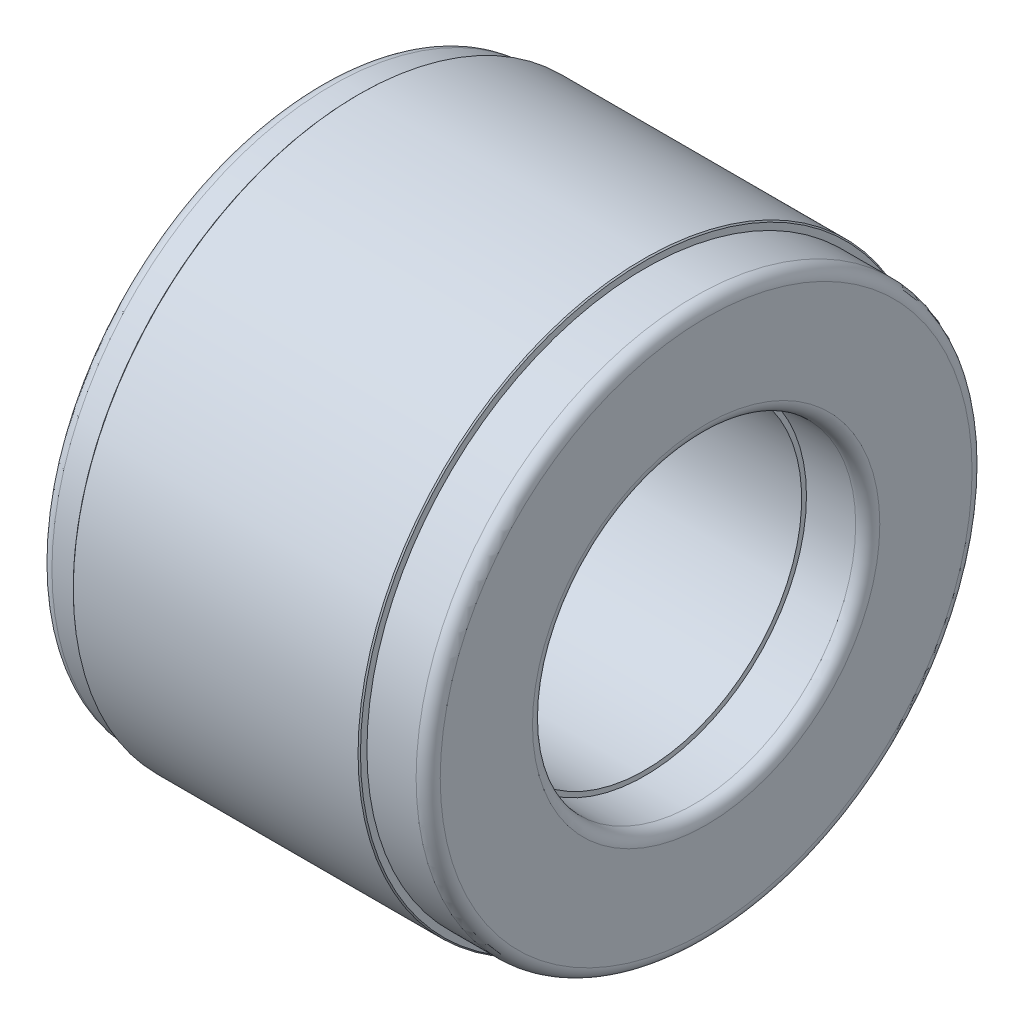
ISO-10303-21;
HEADER;
FILE_DESCRIPTION(('STEP AP214'),'2;1');
FILE_NAME('part.step','',(''),(''),'','','');
FILE_SCHEMA(('AUTOMOTIVE_DESIGN { 1 0 10303 214 1 1 1 1 }'));
ENDSEC;
DATA;
#1=APPLICATION_CONTEXT('core data for automotive mechanical design processes');
#2=APPLICATION_PROTOCOL_DEFINITION('international standard','automotive_design',2000,#1);
#3=PRODUCT_CONTEXT('',#1,'mechanical');
#4=PRODUCT('Part','Part','',(#3));
#5=PRODUCT_RELATED_PRODUCT_CATEGORY('part','',(#4));
#6=PRODUCT_DEFINITION_FORMATION('','',#4);
#7=PRODUCT_DEFINITION_CONTEXT('part definition',#1,'design');
#8=PRODUCT_DEFINITION('design','',#6,#7);
#9=PRODUCT_DEFINITION_SHAPE('','',#8);
#10=(LENGTH_UNIT() NAMED_UNIT(*) SI_UNIT(.MILLI.,.METRE.));
#11=(NAMED_UNIT(*) PLANE_ANGLE_UNIT() SI_UNIT($,.RADIAN.));
#12=(NAMED_UNIT(*) SI_UNIT($,.STERADIAN.) SOLID_ANGLE_UNIT());
#13=UNCERTAINTY_MEASURE_WITH_UNIT(LENGTH_MEASURE(1.E-05),#10,'distance_accuracy_value','');
#14=(GEOMETRIC_REPRESENTATION_CONTEXT(3) GLOBAL_UNCERTAINTY_ASSIGNED_CONTEXT((#13)) GLOBAL_UNIT_ASSIGNED_CONTEXT((#10,
#11,#12)) REPRESENTATION_CONTEXT('',''));
#15=CARTESIAN_POINT('',(0.,0.,0.));
#16=DIRECTION('',(0.,0.,1.));
#17=DIRECTION('',(1.,0.,0.));
#18=AXIS2_PLACEMENT_3D('',#15,#16,#17);
#19=CARTESIAN_POINT('',(0.,0.,0.));
#20=DIRECTION('',(-1.,0.,0.));
#21=DIRECTION('',(0.,0.,1.));
#22=AXIS2_PLACEMENT_3D('',#19,#20,#21);
#23=CYLINDRICAL_SURFACE('',#22,46.355);
#24=CARTESIAN_POINT('',(2.,0.,0.));
#25=DIRECTION('',(1.,0.,0.));
#26=DIRECTION('',(0.,0.,-1.));
#27=AXIS2_PLACEMENT_3D('',#24,#25,#26);
#28=CIRCLE('',#27,46.355);
#29=CARTESIAN_POINT('',(2.,0.,-46.355));
#30=VERTEX_POINT('',#29);
#31=EDGE_CURVE('E66',#30,#30,#28,.T.);
#32=ORIENTED_EDGE('',*,*,#31,.T.);
#33=EDGE_LOOP('',(#32));
#34=FACE_BOUND('',#33,.T.);
#35=CARTESIAN_POINT('',(6.35,0.,0.));
#36=DIRECTION('',(-1.,0.,0.));
#37=DIRECTION('',(0.,0.,1.));
#38=AXIS2_PLACEMENT_3D('',#35,#36,#37);
#39=CIRCLE('',#38,46.355);
#40=CARTESIAN_POINT('',(6.35,0.,46.355));
#41=VERTEX_POINT('',#40);
#42=EDGE_CURVE('E93',#41,#41,#39,.T.);
#43=ORIENTED_EDGE('',*,*,#42,.T.);
#44=EDGE_LOOP('',(#43));
#45=FACE_BOUND('',#44,.T.);
#46=ADVANCED_FACE('F34',(#34,#45),#23,.T.);
#47=CARTESIAN_POINT('',(0.,46.355,0.));
#48=DIRECTION('',(1.,0.,0.));
#49=DIRECTION('',(0.,0.,-1.));
#50=AXIS2_PLACEMENT_3D('',#47,#48,#49);
#51=PLANE('',#50);
#52=CARTESIAN_POINT('',(0.,0.,0.));
#53=DIRECTION('',(1.,0.,0.));
#54=DIRECTION('',(0.,0.,-1.));
#55=AXIS2_PLACEMENT_3D('',#52,#53,#54);
#56=CIRCLE('',#55,29.305);
#57=CARTESIAN_POINT('',(0.,0.,-29.305));
#58=VERTEX_POINT('',#57);
#59=EDGE_CURVE('E69',#58,#58,#56,.T.);
#60=ORIENTED_EDGE('',*,*,#59,.T.);
#61=EDGE_LOOP('',(#60));
#62=FACE_BOUND('',#61,.T.);
#63=CARTESIAN_POINT('',(0.,0.,0.));
#64=DIRECTION('',(1.,0.,0.));
#65=DIRECTION('',(0.,0.,-1.));
#66=AXIS2_PLACEMENT_3D('',#63,#64,#65);
#67=CIRCLE('',#66,44.355);
#68=CARTESIAN_POINT('',(0.,0.,-44.355));
#69=VERTEX_POINT('',#68);
#70=EDGE_CURVE('E72',#69,#69,#67,.F.);
#71=ORIENTED_EDGE('',*,*,#70,.T.);
#72=EDGE_LOOP('',(#71));
#73=FACE_BOUND('',#72,.T.);
#74=ADVANCED_FACE('F114',(#62,#73),#51,.F.);
#75=CARTESIAN_POINT('',(0.,0.,0.));
#76=DIRECTION('',(-1.,0.,0.));
#77=DIRECTION('',(0.,0.,1.));
#78=AXIS2_PLACEMENT_3D('',#75,#76,#77);
#79=CYLINDRICAL_SURFACE('',#78,27.305);
#80=CARTESIAN_POINT('',(2.,0.,0.));
#81=DIRECTION('',(1.,0.,0.));
#82=DIRECTION('',(0.,0.,-1.));
#83=AXIS2_PLACEMENT_3D('',#80,#81,#82);
#84=CIRCLE('',#83,27.305);
#85=CARTESIAN_POINT('',(2.,0.,-27.305));
#86=VERTEX_POINT('',#85);
#87=EDGE_CURVE('E75',#86,#86,#84,.F.);
#88=ORIENTED_EDGE('',*,*,#87,.T.);
#89=EDGE_LOOP('',(#88));
#90=FACE_BOUND('',#89,.T.);
#91=CARTESIAN_POINT('',(6.35,0.,0.));
#92=DIRECTION('',(-1.,0.,0.));
#93=DIRECTION('',(0.,0.,1.));
#94=AXIS2_PLACEMENT_3D('',#91,#92,#93);
#95=CIRCLE('',#94,27.305);
#96=CARTESIAN_POINT('',(6.35,0.,27.305));
#97=VERTEX_POINT('',#96);
#98=EDGE_CURVE('E78',#97,#97,#95,.T.);
#99=ORIENTED_EDGE('',*,*,#98,.F.);
#100=EDGE_LOOP('',(#99));
#101=FACE_BOUND('',#100,.T.);
#102=ADVANCED_FACE('F120',(#90,#101),#79,.F.);
#103=CARTESIAN_POINT('',(6.35,27.305,0.));
#104=DIRECTION('',(1.,0.,0.));
#105=DIRECTION('',(0.,0.,-1.));
#106=AXIS2_PLACEMENT_3D('',#103,#104,#105);
#107=PLANE('',#106);
#108=CARTESIAN_POINT('',(6.35,0.,0.));
#109=DIRECTION('',(-1.,0.,0.));
#110=DIRECTION('',(0.,0.,1.));
#111=AXIS2_PLACEMENT_3D('',#108,#109,#110);
#112=CIRCLE('',#111,26.);
#113=CARTESIAN_POINT('',(6.35,0.,26.));
#114=VERTEX_POINT('',#113);
#115=EDGE_CURVE('E81',#114,#114,#112,.T.);
#116=ORIENTED_EDGE('',*,*,#115,.F.);
#117=EDGE_LOOP('',(#116));
#118=FACE_BOUND('',#117,.T.);
#119=ORIENTED_EDGE('',*,*,#98,.T.);
#120=EDGE_LOOP('',(#119));
#121=FACE_BOUND('',#120,.T.);
#122=ADVANCED_FACE('F237',(#118,#121),#107,.F.);
#123=CARTESIAN_POINT('',(0.,0.,0.));
#124=DIRECTION('',(-1.,0.,0.));
#125=DIRECTION('',(0.,0.,1.));
#126=AXIS2_PLACEMENT_3D('',#123,#124,#125);
#127=CYLINDRICAL_SURFACE('',#126,26.);
#128=CARTESIAN_POINT('',(53.98,0.,0.));
#129=DIRECTION('',(-1.,0.,0.));
#130=DIRECTION('',(0.,0.,1.));
#131=AXIS2_PLACEMENT_3D('',#128,#129,#130);
#132=CIRCLE('',#131,26.);
#133=CARTESIAN_POINT('',(53.98,0.,26.));
#134=VERTEX_POINT('',#133);
#135=EDGE_CURVE('E84',#134,#134,#132,.T.);
#136=ORIENTED_EDGE('',*,*,#135,.F.);
#137=EDGE_LOOP('',(#136));
#138=FACE_BOUND('',#137,.T.);
#139=ORIENTED_EDGE('',*,*,#115,.T.);
#140=EDGE_LOOP('',(#139));
#141=FACE_BOUND('',#140,.T.);
#142=ADVANCED_FACE('F256',(#138,#141),#127,.F.);
#143=CARTESIAN_POINT('',(53.98,26.,0.));
#144=DIRECTION('',(-1.,0.,0.));
#145=DIRECTION('',(0.,0.,1.));
#146=AXIS2_PLACEMENT_3D('',#143,#144,#145);
#147=PLANE('',#146);
#148=CARTESIAN_POINT('',(53.98,0.,0.));
#149=DIRECTION('',(-1.,0.,0.));
#150=DIRECTION('',(0.,0.,1.));
#151=AXIS2_PLACEMENT_3D('',#148,#149,#150);
#152=CIRCLE('',#151,26.8);
#153=CARTESIAN_POINT('',(53.98,0.,26.8));
#154=VERTEX_POINT('',#153);
#155=EDGE_CURVE('E87',#154,#154,#152,.T.);
#156=ORIENTED_EDGE('',*,*,#155,.F.);
#157=EDGE_LOOP('',(#156));
#158=FACE_BOUND('',#157,.T.);
#159=ORIENTED_EDGE('',*,*,#135,.T.);
#160=EDGE_LOOP('',(#159));
#161=FACE_BOUND('',#160,.T.);
#162=ADVANCED_FACE('F225',(#158,#161),#147,.F.);
#163=CARTESIAN_POINT('',(0.,0.,0.));
#164=DIRECTION('',(-1.,0.,0.));
#165=DIRECTION('',(0.,0.,1.));
#166=AXIS2_PLACEMENT_3D('',#163,#164,#165);
#167=CYLINDRICAL_SURFACE('',#166,26.8);
#168=CARTESIAN_POINT('',(62.14,0.,0.));
#169=DIRECTION('',(-1.,0.,0.));
#170=DIRECTION('',(0.,0.,1.));
#171=AXIS2_PLACEMENT_3D('',#168,#169,#170);
#172=CIRCLE('',#171,26.8);
#173=CARTESIAN_POINT('',(62.14,0.,26.8));
#174=VERTEX_POINT('',#173);
#175=EDGE_CURVE('E57',#174,#174,#172,.F.);
#176=ORIENTED_EDGE('',*,*,#175,.T.);
#177=EDGE_LOOP('',(#176));
#178=FACE_BOUND('',#177,.T.);
#179=ORIENTED_EDGE('',*,*,#155,.T.);
#180=EDGE_LOOP('',(#179));
#181=FACE_BOUND('',#180,.T.);
#182=ADVANCED_FACE('F215',(#178,#181),#167,.F.);
#183=CARTESIAN_POINT('',(64.14,26.8,0.));
#184=DIRECTION('',(-1.,0.,0.));
#185=DIRECTION('',(0.,0.,1.));
#186=AXIS2_PLACEMENT_3D('',#183,#184,#185);
#187=PLANE('',#186);
#188=CARTESIAN_POINT('',(64.14,0.,0.));
#189=DIRECTION('',(-1.,0.,0.));
#190=DIRECTION('',(0.,0.,1.));
#191=AXIS2_PLACEMENT_3D('',#188,#189,#190);
#192=CIRCLE('',#191,28.8);
#193=CARTESIAN_POINT('',(64.14,0.,28.8));
#194=VERTEX_POINT('',#193);
#195=EDGE_CURVE('E60',#194,#194,#192,.T.);
#196=ORIENTED_EDGE('',*,*,#195,.T.);
#197=EDGE_LOOP('',(#196));
#198=FACE_BOUND('',#197,.T.);
#199=CARTESIAN_POINT('',(64.14,0.,0.));
#200=DIRECTION('',(-1.,0.,0.));
#201=DIRECTION('',(0.,0.,1.));
#202=AXIS2_PLACEMENT_3D('',#199,#200,#201);
#203=CIRCLE('',#202,44.1);
#204=CARTESIAN_POINT('',(64.14,0.,44.1));
#205=VERTEX_POINT('',#204);
#206=EDGE_CURVE('E63',#205,#205,#203,.F.);
#207=ORIENTED_EDGE('',*,*,#206,.T.);
#208=EDGE_LOOP('',(#207));
#209=FACE_BOUND('',#208,.T.);
#210=ADVANCED_FACE('F205',(#198,#209),#187,.F.);
#211=CARTESIAN_POINT('',(0.,0.,0.));
#212=DIRECTION('',(-1.,0.,0.));
#213=DIRECTION('',(0.,0.,1.));
#214=AXIS2_PLACEMENT_3D('',#211,#212,#213);
#215=CYLINDRICAL_SURFACE('',#214,46.1);
#216=CARTESIAN_POINT('',(62.14,0.,0.));
#217=DIRECTION('',(-1.,0.,0.));
#218=DIRECTION('',(0.,0.,1.));
#219=AXIS2_PLACEMENT_3D('',#216,#217,#218);
#220=CIRCLE('',#219,46.1);
#221=CARTESIAN_POINT('',(62.14,0.,46.1));
#222=VERTEX_POINT('',#221);
#223=EDGE_CURVE('E54',#222,#222,#220,.T.);
#224=ORIENTED_EDGE('',*,*,#223,.T.);
#225=EDGE_LOOP('',(#224));
#226=FACE_BOUND('',#225,.T.);
#227=CARTESIAN_POINT('',(53.98,0.,0.));
#228=DIRECTION('',(-1.,0.,0.));
#229=DIRECTION('',(0.,0.,1.));
#230=AXIS2_PLACEMENT_3D('',#227,#228,#229);
#231=CIRCLE('',#230,46.1);
#232=CARTESIAN_POINT('',(53.98,0.,46.1));
#233=VERTEX_POINT('',#232);
#234=EDGE_CURVE('E90',#233,#233,#231,.T.);
#235=ORIENTED_EDGE('',*,*,#234,.F.);
#236=EDGE_LOOP('',(#235));
#237=FACE_BOUND('',#236,.T.);
#238=ADVANCED_FACE('F174',(#226,#237),#215,.T.);
#239=CARTESIAN_POINT('',(53.98,46.1,0.));
#240=DIRECTION('',(-1.,0.,0.));
#241=DIRECTION('',(0.,0.,1.));
#242=AXIS2_PLACEMENT_3D('',#239,#240,#241);
#243=PLANE('',#242);
#244=CARTESIAN_POINT('',(53.98,0.,0.));
#245=DIRECTION('',(-1.,0.,0.));
#246=DIRECTION('',(0.,0.,1.));
#247=AXIS2_PLACEMENT_3D('',#244,#245,#246);
#248=CIRCLE('',#247,47.17);
#249=CARTESIAN_POINT('',(53.98,0.,47.17));
#250=VERTEX_POINT('',#249);
#251=EDGE_CURVE('E41',#250,#250,#248,.F.);
#252=ORIENTED_EDGE('',*,*,#251,.T.);
#253=EDGE_LOOP('',(#252));
#254=FACE_BOUND('',#253,.T.);
#255=ORIENTED_EDGE('',*,*,#234,.T.);
#256=EDGE_LOOP('',(#255));
#257=FACE_BOUND('',#256,.T.);
#258=ADVANCED_FACE('F110',(#254,#257),#243,.F.);
#259=CARTESIAN_POINT('',(0.,0.,0.));
#260=DIRECTION('',(-1.,0.,0.));
#261=DIRECTION('',(0.,0.,1.));
#262=AXIS2_PLACEMENT_3D('',#259,#260,#261);
#263=CYLINDRICAL_SURFACE('',#262,47.37);
#264=CARTESIAN_POINT('',(53.78,0.,0.));
#265=DIRECTION('',(-1.,0.,0.));
#266=DIRECTION('',(0.,0.,1.));
#267=AXIS2_PLACEMENT_3D('',#264,#265,#266);
#268=CIRCLE('',#267,47.37);
#269=CARTESIAN_POINT('',(53.78,0.,47.37));
#270=VERTEX_POINT('',#269);
#271=EDGE_CURVE('E45',#270,#270,#268,.T.);
#272=ORIENTED_EDGE('',*,*,#271,.T.);
#273=EDGE_LOOP('',(#272));
#274=FACE_BOUND('',#273,.T.);
#275=CARTESIAN_POINT('',(6.55000000000001,0.,0.));
#276=DIRECTION('',(1.,0.,0.));
#277=DIRECTION('',(0.,0.,-1.));
#278=AXIS2_PLACEMENT_3D('',#275,#276,#277);
#279=CIRCLE('',#278,47.37);
#280=CARTESIAN_POINT('',(6.55000000000001,0.,-47.37));
#281=VERTEX_POINT('',#280);
#282=EDGE_CURVE('E49',#281,#281,#279,.T.);
#283=ORIENTED_EDGE('',*,*,#282,.T.);
#284=EDGE_LOOP('',(#283));
#285=FACE_BOUND('',#284,.T.);
#286=ADVANCED_FACE('F101',(#274,#285),#263,.T.);
#287=CARTESIAN_POINT('',(6.35,47.37,0.));
#288=DIRECTION('',(1.,0.,0.));
#289=DIRECTION('',(0.,0.,-1.));
#290=AXIS2_PLACEMENT_3D('',#287,#288,#289);
#291=PLANE('',#290);
#292=CARTESIAN_POINT('',(6.35,0.,0.));
#293=DIRECTION('',(1.,0.,0.));
#294=DIRECTION('',(0.,0.,-1.));
#295=AXIS2_PLACEMENT_3D('',#292,#293,#294);
#296=CIRCLE('',#295,47.17);
#297=CARTESIAN_POINT('',(6.35,0.,-47.17));
#298=VERTEX_POINT('',#297);
#299=EDGE_CURVE('E10',#298,#298,#296,.F.);
#300=ORIENTED_EDGE('',*,*,#299,.T.);
#301=EDGE_LOOP('',(#300));
#302=FACE_BOUND('',#301,.T.);
#303=ORIENTED_EDGE('',*,*,#42,.F.);
#304=EDGE_LOOP('',(#303));
#305=FACE_BOUND('',#304,.T.);
#306=ADVANCED_FACE('F98',(#302,#305),#291,.F.);
#307=CARTESIAN_POINT('',(2.,0.,0.));
#308=DIRECTION('',(1.,0.,0.));
#309=DIRECTION('',(0.,0.,-1.));
#310=AXIS2_PLACEMENT_3D('',#307,#308,#309);
#311=TOROIDAL_SURFACE('',#310,29.305,2.);
#312=ORIENTED_EDGE('',*,*,#59,.F.);
#313=EDGE_LOOP('',(#312));
#314=FACE_BOUND('',#313,.T.);
#315=ORIENTED_EDGE('',*,*,#87,.F.);
#316=EDGE_LOOP('',(#315));
#317=FACE_BOUND('',#316,.T.);
#318=ADVANCED_FACE('F100',(#314,#317),#311,.T.);
#319=CARTESIAN_POINT('',(2.,0.,0.));
#320=DIRECTION('',(1.,0.,0.));
#321=DIRECTION('',(0.,0.,-1.));
#322=AXIS2_PLACEMENT_3D('',#319,#320,#321);
#323=TOROIDAL_SURFACE('',#322,44.355,2.);
#324=ORIENTED_EDGE('',*,*,#31,.F.);
#325=EDGE_LOOP('',(#324));
#326=FACE_BOUND('',#325,.T.);
#327=ORIENTED_EDGE('',*,*,#70,.F.);
#328=EDGE_LOOP('',(#327));
#329=FACE_BOUND('',#328,.T.);
#330=ADVANCED_FACE('F107',(#326,#329),#323,.T.);
#331=CARTESIAN_POINT('',(62.14,0.,0.));
#332=DIRECTION('',(-1.,0.,0.));
#333=DIRECTION('',(0.,0.,1.));
#334=AXIS2_PLACEMENT_3D('',#331,#332,#333);
#335=TOROIDAL_SURFACE('',#334,28.8,2.);
#336=ORIENTED_EDGE('',*,*,#175,.F.);
#337=EDGE_LOOP('',(#336));
#338=FACE_BOUND('',#337,.T.);
#339=ORIENTED_EDGE('',*,*,#195,.F.);
#340=EDGE_LOOP('',(#339));
#341=FACE_BOUND('',#340,.T.);
#342=ADVANCED_FACE('F127',(#338,#341),#335,.T.);
#343=CARTESIAN_POINT('',(62.14,0.,0.));
#344=DIRECTION('',(-1.,0.,0.));
#345=DIRECTION('',(0.,0.,1.));
#346=AXIS2_PLACEMENT_3D('',#343,#344,#345);
#347=TOROIDAL_SURFACE('',#346,44.1,2.);
#348=ORIENTED_EDGE('',*,*,#206,.F.);
#349=EDGE_LOOP('',(#348));
#350=FACE_BOUND('',#349,.T.);
#351=ORIENTED_EDGE('',*,*,#223,.F.);
#352=EDGE_LOOP('',(#351));
#353=FACE_BOUND('',#352,.T.);
#354=ADVANCED_FACE('F131',(#350,#353),#347,.T.);
#355=CARTESIAN_POINT('',(53.78,0.,0.));
#356=DIRECTION('',(-1.,0.,0.));
#357=DIRECTION('',(0.,0.,1.));
#358=AXIS2_PLACEMENT_3D('',#355,#356,#357);
#359=CONICAL_SURFACE('',#358,47.37,0.785398163397448);
#360=ORIENTED_EDGE('',*,*,#251,.F.);
#361=EDGE_LOOP('',(#360));
#362=FACE_BOUND('',#361,.T.);
#363=ORIENTED_EDGE('',*,*,#271,.F.);
#364=EDGE_LOOP('',(#363));
#365=FACE_BOUND('',#364,.T.);
#366=ADVANCED_FACE('F134',(#362,#365),#359,.T.);
#367=CARTESIAN_POINT('',(6.35,0.,0.));
#368=DIRECTION('',(1.,0.,0.));
#369=DIRECTION('',(0.,0.,-1.));
#370=AXIS2_PLACEMENT_3D('',#367,#368,#369);
#371=CONICAL_SURFACE('',#370,47.17,0.785398163397431);
#372=ORIENTED_EDGE('',*,*,#282,.F.);
#373=EDGE_LOOP('',(#372));
#374=FACE_BOUND('',#373,.T.);
#375=ORIENTED_EDGE('',*,*,#299,.F.);
#376=EDGE_LOOP('',(#375));
#377=FACE_BOUND('',#376,.T.);
#378=ADVANCED_FACE('F36',(#374,#377),#371,.T.);
#379=CLOSED_SHELL('',(#46,#74,#102,#122,#142,#162,#182,#210,#238,#258,#286,#306,#318,#330,#342,
#354,#366,#378));
#380=MANIFOLD_SOLID_BREP('B2',#379);
#381=ADVANCED_BREP_SHAPE_REPRESENTATION('',(#18,#380),#14);
#382=SHAPE_DEFINITION_REPRESENTATION(#9,#381);
ENDSEC;
END-ISO-10303-21;
